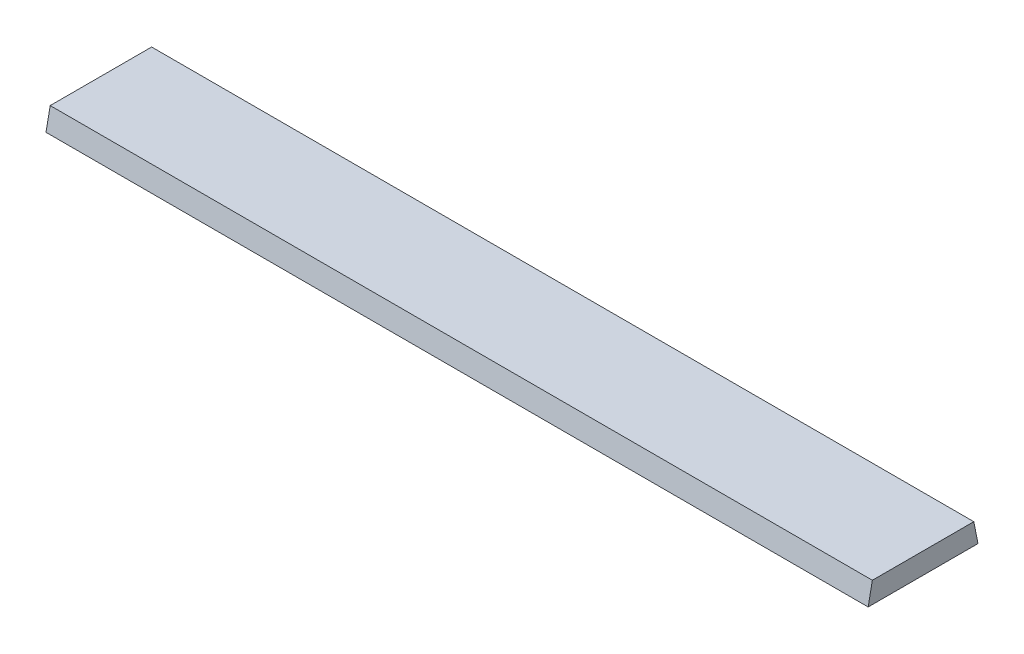
ISO-10303-21;
HEADER;
FILE_DESCRIPTION(('STEP AP214'),'2;1');
FILE_NAME('part.step','',(''),(''),'','','');
FILE_SCHEMA(('AUTOMOTIVE_DESIGN { 1 0 10303 214 1 1 1 1 }'));
ENDSEC;
DATA;
#1=APPLICATION_CONTEXT('core data for automotive mechanical design processes');
#2=APPLICATION_PROTOCOL_DEFINITION('international standard','automotive_design',2000,#1);
#3=PRODUCT_CONTEXT('',#1,'mechanical');
#4=PRODUCT('Part','Part','',(#3));
#5=PRODUCT_RELATED_PRODUCT_CATEGORY('part','',(#4));
#6=PRODUCT_DEFINITION_FORMATION('','',#4);
#7=PRODUCT_DEFINITION_CONTEXT('part definition',#1,'design');
#8=PRODUCT_DEFINITION('design','',#6,#7);
#9=PRODUCT_DEFINITION_SHAPE('','',#8);
#10=(LENGTH_UNIT() NAMED_UNIT(*) SI_UNIT(.MILLI.,.METRE.));
#11=(NAMED_UNIT(*) PLANE_ANGLE_UNIT() SI_UNIT($,.RADIAN.));
#12=(NAMED_UNIT(*) SI_UNIT($,.STERADIAN.) SOLID_ANGLE_UNIT());
#13=UNCERTAINTY_MEASURE_WITH_UNIT(LENGTH_MEASURE(1.E-05),#10,'distance_accuracy_value','');
#14=(GEOMETRIC_REPRESENTATION_CONTEXT(3) GLOBAL_UNCERTAINTY_ASSIGNED_CONTEXT((#13)) GLOBAL_UNIT_ASSIGNED_CONTEXT((#10,
#11,#12)) REPRESENTATION_CONTEXT('',''));
#15=CARTESIAN_POINT('',(0.,0.,0.));
#16=DIRECTION('',(0.,0.,1.));
#17=DIRECTION('',(1.,0.,0.));
#18=AXIS2_PLACEMENT_3D('',#15,#16,#17);
#19=CARTESIAN_POINT('',(742.95,0.,-49.6257517562719));
#20=DIRECTION('',(0.,-0.195090322016132,0.98078528040323));
#21=DIRECTION('',(0.,-0.98078528040323,-0.195090322016132));
#22=AXIS2_PLACEMENT_3D('',#19,#20,#21);
#23=PLANE('',#22);
#24=DIRECTION('',(0.,0.98078528040323,0.195090322016132));
#25=VECTOR('',#24,1.);
#26=CARTESIAN_POINT('',(0.,0.,-49.6257517562719));
#27=LINE('',#26,#25);
#28=CARTESIAN_POINT('',(0.,0.,-49.6257517562719));
#29=VERTEX_POINT('',#28);
#30=CARTESIAN_POINT('',(0.,19.05,-45.8364711576894));
#31=VERTEX_POINT('',#30);
#32=EDGE_CURVE('E98',#29,#31,#27,.T.);
#33=ORIENTED_EDGE('',*,*,#32,.T.);
#34=DIRECTION('',(-1.,0.,0.));
#35=VECTOR('',#34,1.);
#36=CARTESIAN_POINT('',(742.95,19.05,-45.8364711576894));
#37=LINE('',#36,#35);
#38=CARTESIAN_POINT('',(742.95,19.05,-45.8364711576894));
#39=VERTEX_POINT('',#38);
#40=EDGE_CURVE('E11',#39,#31,#37,.T.);
#41=ORIENTED_EDGE('',*,*,#40,.F.);
#42=DIRECTION('',(0.,0.98078528040323,0.195090322016132));
#43=VECTOR('',#42,1.);
#44=CARTESIAN_POINT('',(742.95,0.,-49.6257517562719));
#45=LINE('',#44,#43);
#46=CARTESIAN_POINT('',(742.95,0.,-49.6257517562719));
#47=VERTEX_POINT('',#46);
#48=EDGE_CURVE('E86',#47,#39,#45,.T.);
#49=ORIENTED_EDGE('',*,*,#48,.F.);
#50=DIRECTION('',(-1.,0.,0.));
#51=VECTOR('',#50,1.);
#52=CARTESIAN_POINT('',(742.95,0.,-49.6257517562719));
#53=LINE('',#52,#51);
#54=EDGE_CURVE('E94',#47,#29,#53,.T.);
#55=ORIENTED_EDGE('',*,*,#54,.T.);
#56=EDGE_LOOP('',(#33,#41,#49,#55));
#57=FACE_BOUND('',#56,.T.);
#58=ADVANCED_FACE('F35',(#57),#23,.F.);
#59=CARTESIAN_POINT('',(742.95,19.05,45.8364711576893));
#60=DIRECTION('',(0.,-1.,0.));
#61=DIRECTION('',(0.,0.,-1.));
#62=AXIS2_PLACEMENT_3D('',#59,#60,#61);
#63=PLANE('',#62);
#64=DIRECTION('',(0.,0.,1.));
#65=VECTOR('',#64,1.);
#66=CARTESIAN_POINT('',(0.,19.05,45.8364711576893));
#67=LINE('',#66,#65);
#68=CARTESIAN_POINT('',(0.,19.05,45.8364711576893));
#69=VERTEX_POINT('',#68);
#70=EDGE_CURVE('E90',#31,#69,#67,.T.);
#71=ORIENTED_EDGE('',*,*,#70,.T.);
#72=DIRECTION('',(-1.,0.,0.));
#73=VECTOR('',#72,1.);
#74=CARTESIAN_POINT('',(742.95,19.05,45.8364711576893));
#75=LINE('',#74,#73);
#76=CARTESIAN_POINT('',(742.95,19.05,45.8364711576893));
#77=VERTEX_POINT('',#76);
#78=EDGE_CURVE('E43',#77,#69,#75,.T.);
#79=ORIENTED_EDGE('',*,*,#78,.F.);
#80=DIRECTION('',(0.,0.,1.));
#81=VECTOR('',#80,1.);
#82=CARTESIAN_POINT('',(742.95,19.05,45.8364711576893));
#83=LINE('',#82,#81);
#84=EDGE_CURVE('E81',#39,#77,#83,.T.);
#85=ORIENTED_EDGE('',*,*,#84,.F.);
#86=ORIENTED_EDGE('',*,*,#40,.T.);
#87=EDGE_LOOP('',(#71,#79,#85,#86));
#88=FACE_BOUND('',#87,.T.);
#89=ADVANCED_FACE('F89',(#88),#63,.F.);
#90=CARTESIAN_POINT('',(742.95,0.,49.6257517562719));
#91=DIRECTION('',(0.,-0.195090322016132,-0.98078528040323));
#92=DIRECTION('',(0.,0.98078528040323,-0.195090322016132));
#93=AXIS2_PLACEMENT_3D('',#90,#91,#92);
#94=PLANE('',#93);
#95=DIRECTION('',(0.,-0.98078528040323,0.195090322016132));
#96=VECTOR('',#95,1.);
#97=CARTESIAN_POINT('',(0.,0.,49.6257517562719));
#98=LINE('',#97,#96);
#99=CARTESIAN_POINT('',(0.,0.,49.6257517562719));
#100=VERTEX_POINT('',#99);
#101=EDGE_CURVE('E68',#69,#100,#98,.T.);
#102=ORIENTED_EDGE('',*,*,#101,.T.);
#103=DIRECTION('',(-1.,0.,0.));
#104=VECTOR('',#103,1.);
#105=CARTESIAN_POINT('',(742.95,0.,49.6257517562719));
#106=LINE('',#105,#104);
#107=CARTESIAN_POINT('',(742.95,0.,49.6257517562719));
#108=VERTEX_POINT('',#107);
#109=EDGE_CURVE('E91',#108,#100,#106,.T.);
#110=ORIENTED_EDGE('',*,*,#109,.F.);
#111=DIRECTION('',(0.,-0.98078528040323,0.195090322016132));
#112=VECTOR('',#111,1.);
#113=CARTESIAN_POINT('',(742.95,0.,49.6257517562719));
#114=LINE('',#113,#112);
#115=EDGE_CURVE('E84',#77,#108,#114,.T.);
#116=ORIENTED_EDGE('',*,*,#115,.F.);
#117=ORIENTED_EDGE('',*,*,#78,.T.);
#118=EDGE_LOOP('',(#102,#110,#116,#117));
#119=FACE_BOUND('',#118,.T.);
#120=ADVANCED_FACE('F92',(#119),#94,.F.);
#121=CARTESIAN_POINT('',(742.95,0.,-49.6257517562719));
#122=DIRECTION('',(0.,1.,0.));
#123=DIRECTION('',(0.,0.,1.));
#124=AXIS2_PLACEMENT_3D('',#121,#122,#123);
#125=PLANE('',#124);
#126=DIRECTION('',(0.,0.,-1.));
#127=VECTOR('',#126,1.);
#128=CARTESIAN_POINT('',(0.,0.,-49.6257517562719));
#129=LINE('',#128,#127);
#130=EDGE_CURVE('E74',#100,#29,#129,.T.);
#131=ORIENTED_EDGE('',*,*,#130,.T.);
#132=ORIENTED_EDGE('',*,*,#54,.F.);
#133=DIRECTION('',(0.,0.,-1.));
#134=VECTOR('',#133,1.);
#135=CARTESIAN_POINT('',(742.95,0.,-49.6257517562719));
#136=LINE('',#135,#134);
#137=EDGE_CURVE('E51',#108,#47,#136,.T.);
#138=ORIENTED_EDGE('',*,*,#137,.F.);
#139=ORIENTED_EDGE('',*,*,#109,.T.);
#140=EDGE_LOOP('',(#131,#132,#138,#139));
#141=FACE_BOUND('',#140,.T.);
#142=ADVANCED_FACE('F105',(#141),#125,.F.);
#143=CARTESIAN_POINT('',(742.95,0.,0.));
#144=DIRECTION('',(-1.,0.,0.));
#145=DIRECTION('',(0.,0.,1.));
#146=AXIS2_PLACEMENT_3D('',#143,#144,#145);
#147=PLANE('',#146);
#148=ORIENTED_EDGE('',*,*,#48,.T.);
#149=ORIENTED_EDGE('',*,*,#84,.T.);
#150=ORIENTED_EDGE('',*,*,#115,.T.);
#151=ORIENTED_EDGE('',*,*,#137,.T.);
#152=EDGE_LOOP('',(#148,#149,#150,#151));
#153=FACE_BOUND('',#152,.T.);
#154=ADVANCED_FACE('F82',(#153),#147,.F.);
#155=CARTESIAN_POINT('',(0.,0.,0.));
#156=DIRECTION('',(-1.,0.,0.));
#157=DIRECTION('',(0.,0.,1.));
#158=AXIS2_PLACEMENT_3D('',#155,#156,#157);
#159=PLANE('',#158);
#160=ORIENTED_EDGE('',*,*,#32,.F.);
#161=ORIENTED_EDGE('',*,*,#130,.F.);
#162=ORIENTED_EDGE('',*,*,#101,.F.);
#163=ORIENTED_EDGE('',*,*,#70,.F.);
#164=EDGE_LOOP('',(#160,#161,#162,#163));
#165=FACE_BOUND('',#164,.T.);
#166=ADVANCED_FACE('F108',(#165),#159,.T.);
#167=CLOSED_SHELL('',(#58,#89,#120,#142,#154,#166));
#168=MANIFOLD_SOLID_BREP('B2',#167);
#169=ADVANCED_BREP_SHAPE_REPRESENTATION('',(#18,#168),#14);
#170=SHAPE_DEFINITION_REPRESENTATION(#9,#169);
ENDSEC;
END-ISO-10303-21;
